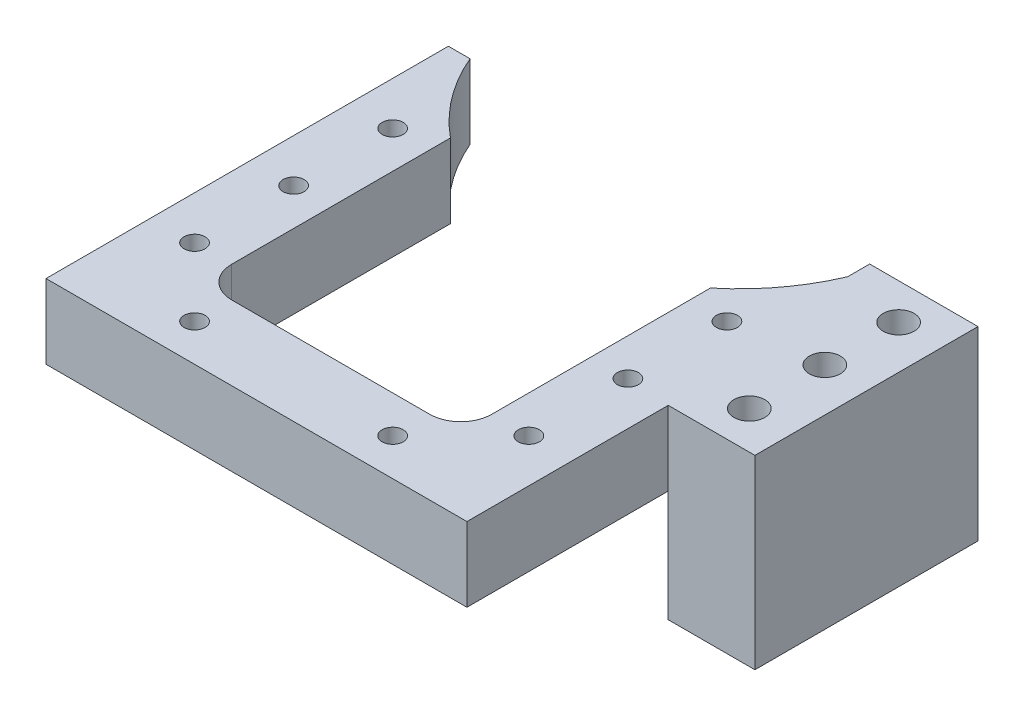
ISO-10303-21;
HEADER;
FILE_DESCRIPTION(('STEP AP214'),'2;1');
FILE_NAME('part.step','',(''),(''),'','','');
FILE_SCHEMA(('AUTOMOTIVE_DESIGN { 1 0 10303 214 1 1 1 1 }'));
ENDSEC;
DATA;
#1=APPLICATION_CONTEXT('core data for automotive mechanical design processes');
#2=APPLICATION_PROTOCOL_DEFINITION('international standard','automotive_design',2000,#1);
#3=PRODUCT_CONTEXT('',#1,'mechanical');
#4=PRODUCT('Part','Part','',(#3));
#5=PRODUCT_RELATED_PRODUCT_CATEGORY('part','',(#4));
#6=PRODUCT_DEFINITION_FORMATION('','',#4);
#7=PRODUCT_DEFINITION_CONTEXT('part definition',#1,'design');
#8=PRODUCT_DEFINITION('design','',#6,#7);
#9=PRODUCT_DEFINITION_SHAPE('','',#8);
#10=(LENGTH_UNIT() NAMED_UNIT(*) SI_UNIT(.MILLI.,.METRE.));
#11=(NAMED_UNIT(*) PLANE_ANGLE_UNIT() SI_UNIT($,.RADIAN.));
#12=(NAMED_UNIT(*) SI_UNIT($,.STERADIAN.) SOLID_ANGLE_UNIT());
#13=UNCERTAINTY_MEASURE_WITH_UNIT(LENGTH_MEASURE(1.E-05),#10,'distance_accuracy_value','');
#14=(GEOMETRIC_REPRESENTATION_CONTEXT(3) GLOBAL_UNCERTAINTY_ASSIGNED_CONTEXT((#13)) GLOBAL_UNIT_ASSIGNED_CONTEXT((#10,
#11,#12)) REPRESENTATION_CONTEXT('',''));
#15=CARTESIAN_POINT('',(0.,0.,0.));
#16=DIRECTION('',(0.,0.,1.));
#17=DIRECTION('',(1.,0.,0.));
#18=AXIS2_PLACEMENT_3D('',#15,#16,#17);
#19=CARTESIAN_POINT('',(17.,-9.,4.72));
#20=DIRECTION('',(1.,0.,0.));
#21=DIRECTION('',(0.,0.,-1.));
#22=AXIS2_PLACEMENT_3D('',#19,#20,#21);
#23=PLANE('',#22);
#24=DIRECTION('',(0.,0.,-1.));
#25=VECTOR('',#24,1.);
#26=CARTESIAN_POINT('',(17.,0.,6.5));
#27=LINE('',#26,#25);
#28=CARTESIAN_POINT('',(17.,0.,22.74));
#29=VERTEX_POINT('',#28);
#30=CARTESIAN_POINT('',(17.,0.,4.72));
#31=VERTEX_POINT('',#30);
#32=EDGE_CURVE('E159',#29,#31,#27,.T.);
#33=ORIENTED_EDGE('',*,*,#32,.T.);
#34=DIRECTION('',(0.,1.,0.));
#35=VECTOR('',#34,1.);
#36=CARTESIAN_POINT('',(17.,-9.,4.72));
#37=LINE('',#36,#35);
#38=CARTESIAN_POINT('',(17.,-9.,4.72));
#39=VERTEX_POINT('',#38);
#40=EDGE_CURVE('E254',#39,#31,#37,.T.);
#41=ORIENTED_EDGE('',*,*,#40,.F.);
#42=DIRECTION('',(0.,0.,-1.));
#43=VECTOR('',#42,1.);
#44=CARTESIAN_POINT('',(17.,-9.,22.74));
#45=LINE('',#44,#43);
#46=CARTESIAN_POINT('',(17.,-9.,22.74));
#47=VERTEX_POINT('',#46);
#48=EDGE_CURVE('E263',#47,#39,#45,.T.);
#49=ORIENTED_EDGE('',*,*,#48,.F.);
#50=DIRECTION('',(0.,1.,0.));
#51=VECTOR('',#50,1.);
#52=CARTESIAN_POINT('',(17.,-9.,22.74));
#53=LINE('',#52,#51);
#54=EDGE_CURVE('E250',#47,#29,#53,.T.);
#55=ORIENTED_EDGE('',*,*,#54,.T.);
#56=EDGE_LOOP('',(#33,#41,#49,#55));
#57=FACE_BOUND('',#56,.T.);
#58=ADVANCED_FACE('F32',(#57),#23,.F.);
#59=CARTESIAN_POINT('',(0.,6.,0.));
#60=DIRECTION('',(0.,1.,0.));
#61=DIRECTION('',(0.,0.,1.));
#62=AXIS2_PLACEMENT_3D('',#59,#60,#61);
#63=PLANE('',#62);
#64=DIRECTION('',(0.,0.,1.));
#65=VECTOR('',#64,1.);
#66=CARTESIAN_POINT('',(15.25,6.,4.72));
#67=LINE('',#66,#65);
#68=CARTESIAN_POINT('',(15.25,6.,4.72));
#69=VERTEX_POINT('',#68);
#70=CARTESIAN_POINT('',(15.25,6.,6.5));
#71=VERTEX_POINT('',#70);
#72=EDGE_CURVE('E122',#69,#71,#67,.T.);
#73=ORIENTED_EDGE('',*,*,#72,.T.);
#74=CARTESIAN_POINT('',(0.,6.,0.));
#75=DIRECTION('',(0.,-1.,0.));
#76=DIRECTION('',(0.,0.,-1.));
#77=AXIS2_PLACEMENT_3D('',#74,#75,#76);
#78=CIRCLE('',#77,16.5774696501004);
#79=CARTESIAN_POINT('',(10.5,6.,12.8281916106675));
#80=VERTEX_POINT('',#79);
#81=EDGE_CURVE('E110',#71,#80,#78,.T.);
#82=ORIENTED_EDGE('',*,*,#81,.T.);
#83=DIRECTION('',(0.,0.,1.));
#84=VECTOR('',#83,1.);
#85=CARTESIAN_POINT('',(10.5,6.,12.8281916106675));
#86=LINE('',#85,#84);
#87=CARTESIAN_POINT('',(10.5,6.,30.5));
#88=VERTEX_POINT('',#87);
#89=EDGE_CURVE('E117',#80,#88,#86,.T.);
#90=ORIENTED_EDGE('',*,*,#89,.T.);
#91=CARTESIAN_POINT('',(8.,6.,30.5));
#92=DIRECTION('',(0.,1.,0.));
#93=DIRECTION('',(0.,0.,1.));
#94=AXIS2_PLACEMENT_3D('',#91,#92,#93);
#95=CIRCLE('',#94,2.49999999999999);
#96=CARTESIAN_POINT('',(8.,6.,33.));
#97=VERTEX_POINT('',#96);
#98=EDGE_CURVE('E296',#97,#88,#95,.T.);
#99=ORIENTED_EDGE('',*,*,#98,.F.);
#100=DIRECTION('',(-1.,0.,0.));
#101=VECTOR('',#100,1.);
#102=CARTESIAN_POINT('',(8.,6.,33.));
#103=LINE('',#102,#101);
#104=CARTESIAN_POINT('',(-8.,6.,33.));
#105=VERTEX_POINT('',#104);
#106=EDGE_CURVE('E140',#97,#105,#103,.T.);
#107=ORIENTED_EDGE('',*,*,#106,.T.);
#108=CARTESIAN_POINT('',(-8.,6.,30.5));
#109=DIRECTION('',(0.,1.,0.));
#110=DIRECTION('',(0.,0.,1.));
#111=AXIS2_PLACEMENT_3D('',#108,#109,#110);
#112=CIRCLE('',#111,2.49999999999999);
#113=CARTESIAN_POINT('',(-10.5,6.,30.5));
#114=VERTEX_POINT('',#113);
#115=EDGE_CURVE('E299',#114,#105,#112,.T.);
#116=ORIENTED_EDGE('',*,*,#115,.F.);
#117=DIRECTION('',(0.,0.,-1.));
#118=VECTOR('',#117,1.);
#119=CARTESIAN_POINT('',(-10.5,6.,12.8281916106675));
#120=LINE('',#119,#118);
#121=CARTESIAN_POINT('',(-10.5,6.,12.8281916106675));
#122=VERTEX_POINT('',#121);
#123=EDGE_CURVE('E143',#114,#122,#120,.T.);
#124=ORIENTED_EDGE('',*,*,#123,.T.);
#125=CARTESIAN_POINT('',(0.,6.,0.));
#126=DIRECTION('',(0.,-1.,0.));
#127=DIRECTION('',(0.,0.,1.));
#128=AXIS2_PLACEMENT_3D('',#125,#126,#127);
#129=CIRCLE('',#128,16.5774696501004);
#130=CARTESIAN_POINT('',(-15.25,6.,6.5));
#131=VERTEX_POINT('',#130);
#132=EDGE_CURVE('E57',#122,#131,#129,.T.);
#133=ORIENTED_EDGE('',*,*,#132,.T.);
#134=DIRECTION('',(-1.,0.,0.));
#135=VECTOR('',#134,1.);
#136=CARTESIAN_POINT('',(-17.,6.,6.5));
#137=LINE('',#136,#135);
#138=CARTESIAN_POINT('',(-17.,6.,6.5));
#139=VERTEX_POINT('',#138);
#140=EDGE_CURVE('E172',#131,#139,#137,.T.);
#141=ORIENTED_EDGE('',*,*,#140,.T.);
#142=DIRECTION('',(0.,0.,1.));
#143=VECTOR('',#142,1.);
#144=CARTESIAN_POINT('',(-17.,6.,6.5));
#145=LINE('',#144,#143);
#146=CARTESIAN_POINT('',(-17.,6.,39.));
#147=VERTEX_POINT('',#146);
#148=EDGE_CURVE('E99',#139,#147,#145,.T.);
#149=ORIENTED_EDGE('',*,*,#148,.T.);
#150=DIRECTION('',(1.,0.,0.));
#151=VECTOR('',#150,1.);
#152=CARTESIAN_POINT('',(-17.,6.,39.));
#153=LINE('',#152,#151);
#154=CARTESIAN_POINT('',(17.,6.,39.));
#155=VERTEX_POINT('',#154);
#156=EDGE_CURVE('E195',#147,#155,#153,.T.);
#157=ORIENTED_EDGE('',*,*,#156,.T.);
#158=DIRECTION('',(0.,0.,-1.));
#159=VECTOR('',#158,1.);
#160=CARTESIAN_POINT('',(17.,6.,33.5));
#161=LINE('',#160,#159);
#162=CARTESIAN_POINT('',(17.,6.,22.74));
#163=VERTEX_POINT('',#162);
#164=EDGE_CURVE('E125',#155,#163,#161,.T.);
#165=ORIENTED_EDGE('',*,*,#164,.T.);
#166=DIRECTION('',(-1.,0.,0.));
#167=VECTOR('',#166,1.);
#168=CARTESIAN_POINT('',(17.,6.,22.74));
#169=LINE('',#168,#167);
#170=CARTESIAN_POINT('',(24.,6.,22.74));
#171=VERTEX_POINT('',#170);
#172=EDGE_CURVE('E49',#171,#163,#169,.T.);
#173=ORIENTED_EDGE('',*,*,#172,.F.);
#174=DIRECTION('',(0.,0.,1.));
#175=VECTOR('',#174,1.);
#176=CARTESIAN_POINT('',(24.,6.,22.74));
#177=LINE('',#176,#175);
#178=CARTESIAN_POINT('',(24.,6.,4.72));
#179=VERTEX_POINT('',#178);
#180=EDGE_CURVE('E275',#179,#171,#177,.T.);
#181=ORIENTED_EDGE('',*,*,#180,.F.);
#182=DIRECTION('',(1.,0.,0.));
#183=VECTOR('',#182,1.);
#184=CARTESIAN_POINT('',(24.,6.,4.72));
#185=LINE('',#184,#183);
#186=EDGE_CURVE('E272',#69,#179,#185,.T.);
#187=ORIENTED_EDGE('',*,*,#186,.F.);
#188=EDGE_LOOP('',(#73,#82,#90,#99,#107,#116,#124,#133,#141,#149,#157,#165,#173,#181,#187));
#189=FACE_BOUND('',#188,.T.);
#190=CARTESIAN_POINT('',(20.5,6.,19.69));
#191=DIRECTION('',(0.,1.,0.));
#192=DIRECTION('',(0.,0.,1.));
#193=AXIS2_PLACEMENT_3D('',#190,#191,#192);
#194=CIRCLE('',#193,1.25);
#195=CARTESIAN_POINT('',(20.5,6.,20.94));
#196=VERTEX_POINT('',#195);
#197=EDGE_CURVE('E290',#196,#196,#194,.T.);
#198=ORIENTED_EDGE('',*,*,#197,.F.);
#199=EDGE_LOOP('',(#198));
#200=FACE_BOUND('',#199,.T.);
#201=CARTESIAN_POINT('',(20.5,6.,13.59));
#202=DIRECTION('',(0.,1.,0.));
#203=DIRECTION('',(0.,0.,1.));
#204=AXIS2_PLACEMENT_3D('',#201,#202,#203);
#205=CIRCLE('',#204,1.25);
#206=CARTESIAN_POINT('',(20.5,6.,14.84));
#207=VERTEX_POINT('',#206);
#208=EDGE_CURVE('E284',#207,#207,#205,.T.);
#209=ORIENTED_EDGE('',*,*,#208,.F.);
#210=EDGE_LOOP('',(#209));
#211=FACE_BOUND('',#210,.T.);
#212=CARTESIAN_POINT('',(20.5,6.,7.63));
#213=DIRECTION('',(0.,1.,0.));
#214=DIRECTION('',(0.,0.,1.));
#215=AXIS2_PLACEMENT_3D('',#212,#213,#214);
#216=CIRCLE('',#215,1.25);
#217=CARTESIAN_POINT('',(20.5,6.,8.88));
#218=VERTEX_POINT('',#217);
#219=EDGE_CURVE('E278',#218,#218,#216,.T.);
#220=ORIENTED_EDGE('',*,*,#219,.F.);
#221=EDGE_LOOP('',(#220));
#222=FACE_BOUND('',#221,.T.);
#223=CARTESIAN_POINT('',(13.5,6.,22.5));
#224=DIRECTION('',(0.,1.,0.));
#225=DIRECTION('',(0.,0.,1.));
#226=AXIS2_PLACEMENT_3D('',#223,#224,#225);
#227=CIRCLE('',#226,0.85);
#228=CARTESIAN_POINT('',(13.5,6.,23.35));
#229=VERTEX_POINT('',#228);
#230=EDGE_CURVE('E235',#229,#229,#227,.T.);
#231=ORIENTED_EDGE('',*,*,#230,.F.);
#232=EDGE_LOOP('',(#231));
#233=FACE_BOUND('',#232,.T.);
#234=CARTESIAN_POINT('',(8.,6.,36.));
#235=DIRECTION('',(0.,1.,0.));
#236=DIRECTION('',(0.,0.,1.));
#237=AXIS2_PLACEMENT_3D('',#234,#235,#236);
#238=CIRCLE('',#237,0.850000000000001);
#239=CARTESIAN_POINT('',(8.,6.,36.85));
#240=VERTEX_POINT('',#239);
#241=EDGE_CURVE('E223',#240,#240,#238,.T.);
#242=ORIENTED_EDGE('',*,*,#241,.F.);
#243=EDGE_LOOP('',(#242));
#244=FACE_BOUND('',#243,.T.);
#245=CARTESIAN_POINT('',(-13.5,6.,14.5));
#246=DIRECTION('',(0.,1.,0.));
#247=DIRECTION('',(0.,0.,1.));
#248=AXIS2_PLACEMENT_3D('',#245,#246,#247);
#249=CIRCLE('',#248,0.85);
#250=CARTESIAN_POINT('',(-13.5,6.,15.35));
#251=VERTEX_POINT('',#250);
#252=EDGE_CURVE('E211',#251,#251,#249,.T.);
#253=ORIENTED_EDGE('',*,*,#252,.F.);
#254=EDGE_LOOP('',(#253));
#255=FACE_BOUND('',#254,.T.);
#256=CARTESIAN_POINT('',(-13.5,6.,30.5));
#257=DIRECTION('',(0.,1.,0.));
#258=DIRECTION('',(0.,0.,1.));
#259=AXIS2_PLACEMENT_3D('',#256,#257,#258);
#260=CIRCLE('',#259,0.85);
#261=CARTESIAN_POINT('',(-13.5,6.,31.35));
#262=VERTEX_POINT('',#261);
#263=EDGE_CURVE('E154',#262,#262,#260,.T.);
#264=ORIENTED_EDGE('',*,*,#263,.F.);
#265=EDGE_LOOP('',(#264));
#266=FACE_BOUND('',#265,.T.);
#267=CARTESIAN_POINT('',(-13.5,6.,22.5));
#268=DIRECTION('',(0.,1.,0.));
#269=DIRECTION('',(0.,0.,1.));
#270=AXIS2_PLACEMENT_3D('',#267,#268,#269);
#271=CIRCLE('',#270,0.85);
#272=CARTESIAN_POINT('',(-13.5,6.,23.35));
#273=VERTEX_POINT('',#272);
#274=EDGE_CURVE('E205',#273,#273,#271,.T.);
#275=ORIENTED_EDGE('',*,*,#274,.F.);
#276=EDGE_LOOP('',(#275));
#277=FACE_BOUND('',#276,.T.);
#278=CARTESIAN_POINT('',(-8.,6.,36.));
#279=DIRECTION('',(0.,1.,0.));
#280=DIRECTION('',(0.,0.,1.));
#281=AXIS2_PLACEMENT_3D('',#278,#279,#280);
#282=CIRCLE('',#281,0.850000000000002);
#283=CARTESIAN_POINT('',(-8.,6.,36.85));
#284=VERTEX_POINT('',#283);
#285=EDGE_CURVE('E217',#284,#284,#282,.T.);
#286=ORIENTED_EDGE('',*,*,#285,.F.);
#287=EDGE_LOOP('',(#286));
#288=FACE_BOUND('',#287,.T.);
#289=CARTESIAN_POINT('',(13.5,6.,30.5));
#290=DIRECTION('',(0.,1.,0.));
#291=DIRECTION('',(0.,0.,1.));
#292=AXIS2_PLACEMENT_3D('',#289,#290,#291);
#293=CIRCLE('',#292,0.85);
#294=CARTESIAN_POINT('',(13.5,6.,31.35));
#295=VERTEX_POINT('',#294);
#296=EDGE_CURVE('E229',#295,#295,#293,.T.);
#297=ORIENTED_EDGE('',*,*,#296,.F.);
#298=EDGE_LOOP('',(#297));
#299=FACE_BOUND('',#298,.T.);
#300=CARTESIAN_POINT('',(13.5,6.,14.5));
#301=DIRECTION('',(0.,1.,0.));
#302=DIRECTION('',(0.,0.,1.));
#303=AXIS2_PLACEMENT_3D('',#300,#301,#302);
#304=CIRCLE('',#303,0.85);
#305=CARTESIAN_POINT('',(13.5,6.,15.35));
#306=VERTEX_POINT('',#305);
#307=EDGE_CURVE('E241',#306,#306,#304,.T.);
#308=ORIENTED_EDGE('',*,*,#307,.F.);
#309=EDGE_LOOP('',(#308));
#310=FACE_BOUND('',#309,.T.);
#311=ADVANCED_FACE('F112',(#189,#200,#211,#222,#233,#244,#255,#266,#277,#288,#299,#310),#63,.T.);
#312=CARTESIAN_POINT('',(0.,0.,0.));
#313=DIRECTION('',(0.,1.,0.));
#314=DIRECTION('',(0.,0.,1.));
#315=AXIS2_PLACEMENT_3D('',#312,#313,#314);
#316=PLANE('',#315);
#317=DIRECTION('',(0.,0.,-1.));
#318=VECTOR('',#317,1.);
#319=CARTESIAN_POINT('',(-10.5,0.,12.8281916106675));
#320=LINE('',#319,#318);
#321=CARTESIAN_POINT('',(-10.5,0.,30.5));
#322=VERTEX_POINT('',#321);
#323=CARTESIAN_POINT('',(-10.5,0.,12.8281916106675));
#324=VERTEX_POINT('',#323);
#325=EDGE_CURVE('E169',#322,#324,#320,.T.);
#326=ORIENTED_EDGE('',*,*,#325,.F.);
#327=CARTESIAN_POINT('',(-8.,0.,30.5));
#328=DIRECTION('',(0.,-1.,0.));
#329=DIRECTION('',(0.,0.,-1.));
#330=AXIS2_PLACEMENT_3D('',#327,#328,#329);
#331=CIRCLE('',#330,2.49999999999999);
#332=CARTESIAN_POINT('',(-8.,0.,33.));
#333=VERTEX_POINT('',#332);
#334=EDGE_CURVE('E304',#333,#322,#331,.T.);
#335=ORIENTED_EDGE('',*,*,#334,.F.);
#336=DIRECTION('',(-1.,0.,0.));
#337=VECTOR('',#336,1.);
#338=CARTESIAN_POINT('',(8.,0.,33.));
#339=LINE('',#338,#337);
#340=CARTESIAN_POINT('',(8.,0.,33.));
#341=VERTEX_POINT('',#340);
#342=EDGE_CURVE('E166',#341,#333,#339,.T.);
#343=ORIENTED_EDGE('',*,*,#342,.F.);
#344=CARTESIAN_POINT('',(8.,0.,30.5));
#345=DIRECTION('',(0.,-1.,0.));
#346=DIRECTION('',(0.,0.,-1.));
#347=AXIS2_PLACEMENT_3D('',#344,#345,#346);
#348=CIRCLE('',#347,2.49999999999999);
#349=CARTESIAN_POINT('',(10.5,0.,30.5));
#350=VERTEX_POINT('',#349);
#351=EDGE_CURVE('E302',#350,#341,#348,.T.);
#352=ORIENTED_EDGE('',*,*,#351,.F.);
#353=DIRECTION('',(0.,0.,1.));
#354=VECTOR('',#353,1.);
#355=CARTESIAN_POINT('',(10.5,0.,12.8281916106675));
#356=LINE('',#355,#354);
#357=CARTESIAN_POINT('',(10.5,0.,12.8281916106675));
#358=VERTEX_POINT('',#357);
#359=EDGE_CURVE('E164',#358,#350,#356,.T.);
#360=ORIENTED_EDGE('',*,*,#359,.F.);
#361=CARTESIAN_POINT('',(0.,0.,0.));
#362=DIRECTION('',(0.,-1.,0.));
#363=DIRECTION('',(0.,0.,-1.));
#364=AXIS2_PLACEMENT_3D('',#361,#362,#363);
#365=CIRCLE('',#364,16.5774696501004);
#366=CARTESIAN_POINT('',(15.25,0.,6.5));
#367=VERTEX_POINT('',#366);
#368=EDGE_CURVE('E131',#367,#358,#365,.T.);
#369=ORIENTED_EDGE('',*,*,#368,.F.);
#370=DIRECTION('',(0.,0.,-1.));
#371=VECTOR('',#370,1.);
#372=CARTESIAN_POINT('',(15.25,0.,4.72));
#373=LINE('',#372,#371);
#374=CARTESIAN_POINT('',(15.25,0.,4.72));
#375=VERTEX_POINT('',#374);
#376=EDGE_CURVE('E309',#367,#375,#373,.T.);
#377=ORIENTED_EDGE('',*,*,#376,.T.);
#378=DIRECTION('',(1.,0.,0.));
#379=VECTOR('',#378,1.);
#380=CARTESIAN_POINT('',(17.,0.,4.72));
#381=LINE('',#380,#379);
#382=EDGE_CURVE('E306',#375,#31,#381,.T.);
#383=ORIENTED_EDGE('',*,*,#382,.T.);
#384=ORIENTED_EDGE('',*,*,#32,.F.);
#385=CARTESIAN_POINT('',(17.,0.,39.));
#386=VERTEX_POINT('',#385);
#387=EDGE_CURVE('E160',#386,#29,#27,.T.);
#388=ORIENTED_EDGE('',*,*,#387,.F.);
#389=DIRECTION('',(1.,0.,0.));
#390=VECTOR('',#389,1.);
#391=CARTESIAN_POINT('',(-17.,0.,39.));
#392=LINE('',#391,#390);
#393=CARTESIAN_POINT('',(-17.,0.,39.));
#394=VERTEX_POINT('',#393);
#395=EDGE_CURVE('E156',#394,#386,#392,.T.);
#396=ORIENTED_EDGE('',*,*,#395,.F.);
#397=DIRECTION('',(0.,0.,1.));
#398=VECTOR('',#397,1.);
#399=CARTESIAN_POINT('',(-17.,0.,33.5));
#400=LINE('',#399,#398);
#401=CARTESIAN_POINT('',(-17.,0.,6.5));
#402=VERTEX_POINT('',#401);
#403=EDGE_CURVE('E153',#402,#394,#400,.T.);
#404=ORIENTED_EDGE('',*,*,#403,.F.);
#405=DIRECTION('',(-1.,0.,0.));
#406=VECTOR('',#405,1.);
#407=CARTESIAN_POINT('',(-17.,0.,6.5));
#408=LINE('',#407,#406);
#409=CARTESIAN_POINT('',(-15.25,0.,6.5));
#410=VERTEX_POINT('',#409);
#411=EDGE_CURVE('E150',#410,#402,#408,.T.);
#412=ORIENTED_EDGE('',*,*,#411,.F.);
#413=CARTESIAN_POINT('',(0.,0.,0.));
#414=DIRECTION('',(0.,-1.,0.));
#415=DIRECTION('',(0.,0.,1.));
#416=AXIS2_PLACEMENT_3D('',#413,#414,#415);
#417=CIRCLE('',#416,16.5774696501004);
#418=EDGE_CURVE('E90',#324,#410,#417,.T.);
#419=ORIENTED_EDGE('',*,*,#418,.F.);
#420=EDGE_LOOP('',(#326,#335,#343,#352,#360,#369,#377,#383,#384,#388,#396,#404,#412,#419));
#421=FACE_BOUND('',#420,.T.);
#422=CARTESIAN_POINT('',(-13.5,0.,30.5));
#423=DIRECTION('',(0.,1.,0.));
#424=DIRECTION('',(0.,0.,1.));
#425=AXIS2_PLACEMENT_3D('',#422,#423,#424);
#426=CIRCLE('',#425,0.85);
#427=CARTESIAN_POINT('',(-13.5,0.,31.35));
#428=VERTEX_POINT('',#427);
#429=EDGE_CURVE('E202',#428,#428,#426,.T.);
#430=ORIENTED_EDGE('',*,*,#429,.T.);
#431=EDGE_LOOP('',(#430));
#432=FACE_BOUND('',#431,.T.);
#433=CARTESIAN_POINT('',(-13.5,0.,22.5));
#434=DIRECTION('',(0.,1.,0.));
#435=DIRECTION('',(0.,0.,1.));
#436=AXIS2_PLACEMENT_3D('',#433,#434,#435);
#437=CIRCLE('',#436,0.85);
#438=CARTESIAN_POINT('',(-13.5,0.,23.35));
#439=VERTEX_POINT('',#438);
#440=EDGE_CURVE('E208',#439,#439,#437,.T.);
#441=ORIENTED_EDGE('',*,*,#440,.T.);
#442=EDGE_LOOP('',(#441));
#443=FACE_BOUND('',#442,.T.);
#444=CARTESIAN_POINT('',(-13.5,0.,14.5));
#445=DIRECTION('',(0.,1.,0.));
#446=DIRECTION('',(0.,0.,1.));
#447=AXIS2_PLACEMENT_3D('',#444,#445,#446);
#448=CIRCLE('',#447,0.85);
#449=CARTESIAN_POINT('',(-13.5,0.,15.35));
#450=VERTEX_POINT('',#449);
#451=EDGE_CURVE('E214',#450,#450,#448,.T.);
#452=ORIENTED_EDGE('',*,*,#451,.T.);
#453=EDGE_LOOP('',(#452));
#454=FACE_BOUND('',#453,.T.);
#455=CARTESIAN_POINT('',(-8.,0.,36.));
#456=DIRECTION('',(0.,1.,0.));
#457=DIRECTION('',(0.,0.,1.));
#458=AXIS2_PLACEMENT_3D('',#455,#456,#457);
#459=CIRCLE('',#458,0.850000000000002);
#460=CARTESIAN_POINT('',(-8.,0.,36.85));
#461=VERTEX_POINT('',#460);
#462=EDGE_CURVE('E220',#461,#461,#459,.T.);
#463=ORIENTED_EDGE('',*,*,#462,.T.);
#464=EDGE_LOOP('',(#463));
#465=FACE_BOUND('',#464,.T.);
#466=CARTESIAN_POINT('',(8.,0.,36.));
#467=DIRECTION('',(0.,1.,0.));
#468=DIRECTION('',(0.,0.,1.));
#469=AXIS2_PLACEMENT_3D('',#466,#467,#468);
#470=CIRCLE('',#469,0.850000000000001);
#471=CARTESIAN_POINT('',(8.,0.,36.85));
#472=VERTEX_POINT('',#471);
#473=EDGE_CURVE('E226',#472,#472,#470,.T.);
#474=ORIENTED_EDGE('',*,*,#473,.T.);
#475=EDGE_LOOP('',(#474));
#476=FACE_BOUND('',#475,.T.);
#477=CARTESIAN_POINT('',(13.5,0.,30.5));
#478=DIRECTION('',(0.,1.,0.));
#479=DIRECTION('',(0.,0.,1.));
#480=AXIS2_PLACEMENT_3D('',#477,#478,#479);
#481=CIRCLE('',#480,0.85);
#482=CARTESIAN_POINT('',(13.5,0.,31.35));
#483=VERTEX_POINT('',#482);
#484=EDGE_CURVE('E232',#483,#483,#481,.T.);
#485=ORIENTED_EDGE('',*,*,#484,.T.);
#486=EDGE_LOOP('',(#485));
#487=FACE_BOUND('',#486,.T.);
#488=CARTESIAN_POINT('',(13.5,0.,22.5));
#489=DIRECTION('',(0.,1.,0.));
#490=DIRECTION('',(0.,0.,1.));
#491=AXIS2_PLACEMENT_3D('',#488,#489,#490);
#492=CIRCLE('',#491,0.85);
#493=CARTESIAN_POINT('',(13.5,0.,23.35));
#494=VERTEX_POINT('',#493);
#495=EDGE_CURVE('E238',#494,#494,#492,.T.);
#496=ORIENTED_EDGE('',*,*,#495,.T.);
#497=EDGE_LOOP('',(#496));
#498=FACE_BOUND('',#497,.T.);
#499=CARTESIAN_POINT('',(13.5,0.,14.5));
#500=DIRECTION('',(0.,1.,0.));
#501=DIRECTION('',(0.,0.,1.));
#502=AXIS2_PLACEMENT_3D('',#499,#500,#501);
#503=CIRCLE('',#502,0.85);
#504=CARTESIAN_POINT('',(13.5,0.,15.35));
#505=VERTEX_POINT('',#504);
#506=EDGE_CURVE('E244',#505,#505,#503,.T.);
#507=ORIENTED_EDGE('',*,*,#506,.T.);
#508=EDGE_LOOP('',(#507));
#509=FACE_BOUND('',#508,.T.);
#510=ADVANCED_FACE('F320',(#421,#432,#443,#454,#465,#476,#487,#498,#509),#316,.F.);
#511=CARTESIAN_POINT('',(-17.,6.,6.5));
#512=DIRECTION('',(0.,0.,1.));
#513=DIRECTION('',(1.,0.,0.));
#514=AXIS2_PLACEMENT_3D('',#511,#512,#513);
#515=PLANE('',#514);
#516=ORIENTED_EDGE('',*,*,#411,.T.);
#517=DIRECTION('',(0.,-1.,0.));
#518=VECTOR('',#517,1.);
#519=CARTESIAN_POINT('',(-17.,6.,6.5));
#520=LINE('',#519,#518);
#521=EDGE_CURVE('E41',#139,#402,#520,.T.);
#522=ORIENTED_EDGE('',*,*,#521,.F.);
#523=ORIENTED_EDGE('',*,*,#140,.F.);
#524=DIRECTION('',(0.,-1.,0.));
#525=VECTOR('',#524,1.);
#526=CARTESIAN_POINT('',(-15.25,6.,6.5));
#527=LINE('',#526,#525);
#528=EDGE_CURVE('E149',#131,#410,#527,.T.);
#529=ORIENTED_EDGE('',*,*,#528,.T.);
#530=EDGE_LOOP('',(#516,#522,#523,#529));
#531=FACE_BOUND('',#530,.T.);
#532=ADVANCED_FACE('F34',(#531),#515,.F.);
#533=CARTESIAN_POINT('',(-17.,6.,33.5));
#534=DIRECTION('',(1.,0.,0.));
#535=DIRECTION('',(0.,0.,-1.));
#536=AXIS2_PLACEMENT_3D('',#533,#534,#535);
#537=PLANE('',#536);
#538=ORIENTED_EDGE('',*,*,#403,.T.);
#539=DIRECTION('',(0.,-1.,0.));
#540=VECTOR('',#539,1.);
#541=CARTESIAN_POINT('',(-17.,6.,39.));
#542=LINE('',#541,#540);
#543=EDGE_CURVE('E190',#147,#394,#542,.T.);
#544=ORIENTED_EDGE('',*,*,#543,.F.);
#545=ORIENTED_EDGE('',*,*,#148,.F.);
#546=ORIENTED_EDGE('',*,*,#521,.T.);
#547=EDGE_LOOP('',(#538,#544,#545,#546));
#548=FACE_BOUND('',#547,.T.);
#549=ADVANCED_FACE('F387',(#548),#537,.F.);
#550=CARTESIAN_POINT('',(-17.,6.,39.));
#551=DIRECTION('',(0.,0.,-1.));
#552=DIRECTION('',(-1.,0.,0.));
#553=AXIS2_PLACEMENT_3D('',#550,#551,#552);
#554=PLANE('',#553);
#555=ORIENTED_EDGE('',*,*,#395,.T.);
#556=DIRECTION('',(0.,-1.,0.));
#557=VECTOR('',#556,1.);
#558=CARTESIAN_POINT('',(17.,6.,39.));
#559=LINE('',#558,#557);
#560=EDGE_CURVE('E187',#155,#386,#559,.T.);
#561=ORIENTED_EDGE('',*,*,#560,.F.);
#562=ORIENTED_EDGE('',*,*,#156,.F.);
#563=ORIENTED_EDGE('',*,*,#543,.T.);
#564=EDGE_LOOP('',(#555,#561,#562,#563));
#565=FACE_BOUND('',#564,.T.);
#566=ADVANCED_FACE('F384',(#565),#554,.F.);
#567=CARTESIAN_POINT('',(17.,6.,6.5));
#568=DIRECTION('',(-1.,0.,0.));
#569=DIRECTION('',(0.,0.,1.));
#570=AXIS2_PLACEMENT_3D('',#567,#568,#569);
#571=PLANE('',#570);
#572=ORIENTED_EDGE('',*,*,#387,.T.);
#573=EDGE_CURVE('E11',#29,#163,#53,.T.);
#574=ORIENTED_EDGE('',*,*,#573,.T.);
#575=ORIENTED_EDGE('',*,*,#164,.F.);
#576=ORIENTED_EDGE('',*,*,#560,.T.);
#577=EDGE_LOOP('',(#572,#574,#575,#576));
#578=FACE_BOUND('',#577,.T.);
#579=ADVANCED_FACE('F379',(#578),#571,.F.);
#580=CARTESIAN_POINT('',(0.,6.,0.));
#581=DIRECTION('',(0.,-1.,0.));
#582=DIRECTION('',(0.,0.,-1.));
#583=AXIS2_PLACEMENT_3D('',#580,#581,#582);
#584=CYLINDRICAL_SURFACE('',#583,16.5774696501004);
#585=ORIENTED_EDGE('',*,*,#368,.T.);
#586=DIRECTION('',(0.,-1.,0.));
#587=VECTOR('',#586,1.);
#588=CARTESIAN_POINT('',(10.5,6.,12.8281916106675));
#589=LINE('',#588,#587);
#590=EDGE_CURVE('E128',#80,#358,#589,.T.);
#591=ORIENTED_EDGE('',*,*,#590,.F.);
#592=ORIENTED_EDGE('',*,*,#81,.F.);
#593=DIRECTION('',(0.,-1.,0.));
#594=VECTOR('',#593,1.);
#595=CARTESIAN_POINT('',(15.25,6.,6.5));
#596=LINE('',#595,#594);
#597=EDGE_CURVE('E135',#71,#367,#596,.T.);
#598=ORIENTED_EDGE('',*,*,#597,.T.);
#599=EDGE_LOOP('',(#585,#591,#592,#598));
#600=FACE_BOUND('',#599,.T.);
#601=ADVANCED_FACE('F129',(#600),#584,.F.);
#602=CARTESIAN_POINT('',(10.5,6.,12.8281916106675));
#603=DIRECTION('',(1.,0.,0.));
#604=DIRECTION('',(0.,0.,-1.));
#605=AXIS2_PLACEMENT_3D('',#602,#603,#604);
#606=PLANE('',#605);
#607=ORIENTED_EDGE('',*,*,#359,.T.);
#608=DIRECTION('',(0.,-1.,0.));
#609=VECTOR('',#608,1.);
#610=CARTESIAN_POINT('',(10.5,6.,30.5));
#611=LINE('',#610,#609);
#612=EDGE_CURVE('E136',#88,#350,#611,.T.);
#613=ORIENTED_EDGE('',*,*,#612,.F.);
#614=ORIENTED_EDGE('',*,*,#89,.F.);
#615=ORIENTED_EDGE('',*,*,#590,.T.);
#616=EDGE_LOOP('',(#607,#613,#614,#615));
#617=FACE_BOUND('',#616,.T.);
#618=ADVANCED_FACE('F138',(#617),#606,.F.);
#619=CARTESIAN_POINT('',(8.,6.,33.));
#620=DIRECTION('',(0.,0.,1.));
#621=DIRECTION('',(1.,0.,0.));
#622=AXIS2_PLACEMENT_3D('',#619,#620,#621);
#623=PLANE('',#622);
#624=ORIENTED_EDGE('',*,*,#342,.T.);
#625=DIRECTION('',(0.,-1.,0.));
#626=VECTOR('',#625,1.);
#627=CARTESIAN_POINT('',(-8.,6.,33.));
#628=LINE('',#627,#626);
#629=EDGE_CURVE('E179',#105,#333,#628,.T.);
#630=ORIENTED_EDGE('',*,*,#629,.F.);
#631=ORIENTED_EDGE('',*,*,#106,.F.);
#632=DIRECTION('',(0.,-1.,0.));
#633=VECTOR('',#632,1.);
#634=CARTESIAN_POINT('',(8.,6.,33.));
#635=LINE('',#634,#633);
#636=EDGE_CURVE('E182',#97,#341,#635,.T.);
#637=ORIENTED_EDGE('',*,*,#636,.T.);
#638=EDGE_LOOP('',(#624,#630,#631,#637));
#639=FACE_BOUND('',#638,.T.);
#640=ADVANCED_FACE('F403',(#639),#623,.F.);
#641=CARTESIAN_POINT('',(-10.5,6.,12.8281916106675));
#642=DIRECTION('',(-1.,0.,0.));
#643=DIRECTION('',(0.,0.,1.));
#644=AXIS2_PLACEMENT_3D('',#641,#642,#643);
#645=PLANE('',#644);
#646=ORIENTED_EDGE('',*,*,#325,.T.);
#647=DIRECTION('',(0.,-1.,0.));
#648=VECTOR('',#647,1.);
#649=CARTESIAN_POINT('',(-10.5,6.,12.8281916106675));
#650=LINE('',#649,#648);
#651=EDGE_CURVE('E174',#122,#324,#650,.T.);
#652=ORIENTED_EDGE('',*,*,#651,.F.);
#653=ORIENTED_EDGE('',*,*,#123,.F.);
#654=DIRECTION('',(0.,-1.,0.));
#655=VECTOR('',#654,1.);
#656=CARTESIAN_POINT('',(-10.5,6.,30.5));
#657=LINE('',#656,#655);
#658=EDGE_CURVE('E176',#114,#322,#657,.T.);
#659=ORIENTED_EDGE('',*,*,#658,.T.);
#660=EDGE_LOOP('',(#646,#652,#653,#659));
#661=FACE_BOUND('',#660,.T.);
#662=ADVANCED_FACE('F396',(#661),#645,.F.);
#663=CARTESIAN_POINT('',(0.,6.,0.));
#664=DIRECTION('',(0.,-1.,0.));
#665=DIRECTION('',(0.,0.,-1.));
#666=AXIS2_PLACEMENT_3D('',#663,#664,#665);
#667=CYLINDRICAL_SURFACE('',#666,16.5774696501004);
#668=ORIENTED_EDGE('',*,*,#418,.T.);
#669=ORIENTED_EDGE('',*,*,#528,.F.);
#670=ORIENTED_EDGE('',*,*,#132,.F.);
#671=ORIENTED_EDGE('',*,*,#651,.T.);
#672=EDGE_LOOP('',(#668,#669,#670,#671));
#673=FACE_BOUND('',#672,.T.);
#674=ADVANCED_FACE('F390',(#673),#667,.F.);
#675=CARTESIAN_POINT('',(-13.5,6.,30.5));
#676=DIRECTION('',(0.,-1.,0.));
#677=DIRECTION('',(0.,0.,-1.));
#678=AXIS2_PLACEMENT_3D('',#675,#676,#677);
#679=CYLINDRICAL_SURFACE('',#678,0.85);
#680=ORIENTED_EDGE('',*,*,#263,.T.);
#681=EDGE_LOOP('',(#680));
#682=FACE_BOUND('',#681,.T.);
#683=ORIENTED_EDGE('',*,*,#429,.F.);
#684=EDGE_LOOP('',(#683));
#685=FACE_BOUND('',#684,.T.);
#686=ADVANCED_FACE('F456',(#682,#685),#679,.F.);
#687=CARTESIAN_POINT('',(-13.5,6.,22.5));
#688=DIRECTION('',(0.,-1.,0.));
#689=DIRECTION('',(0.,0.,-1.));
#690=AXIS2_PLACEMENT_3D('',#687,#688,#689);
#691=CYLINDRICAL_SURFACE('',#690,0.85);
#692=ORIENTED_EDGE('',*,*,#274,.T.);
#693=EDGE_LOOP('',(#692));
#694=FACE_BOUND('',#693,.T.);
#695=ORIENTED_EDGE('',*,*,#440,.F.);
#696=EDGE_LOOP('',(#695));
#697=FACE_BOUND('',#696,.T.);
#698=ADVANCED_FACE('F452',(#694,#697),#691,.F.);
#699=CARTESIAN_POINT('',(-13.5,6.,14.5));
#700=DIRECTION('',(0.,-1.,0.));
#701=DIRECTION('',(0.,0.,-1.));
#702=AXIS2_PLACEMENT_3D('',#699,#700,#701);
#703=CYLINDRICAL_SURFACE('',#702,0.85);
#704=ORIENTED_EDGE('',*,*,#252,.T.);
#705=EDGE_LOOP('',(#704));
#706=FACE_BOUND('',#705,.T.);
#707=ORIENTED_EDGE('',*,*,#451,.F.);
#708=EDGE_LOOP('',(#707));
#709=FACE_BOUND('',#708,.T.);
#710=ADVANCED_FACE('F448',(#706,#709),#703,.F.);
#711=CARTESIAN_POINT('',(-8.,6.,36.));
#712=DIRECTION('',(0.,-1.,0.));
#713=DIRECTION('',(0.,0.,-1.));
#714=AXIS2_PLACEMENT_3D('',#711,#712,#713);
#715=CYLINDRICAL_SURFACE('',#714,0.850000000000002);
#716=ORIENTED_EDGE('',*,*,#285,.T.);
#717=EDGE_LOOP('',(#716));
#718=FACE_BOUND('',#717,.T.);
#719=ORIENTED_EDGE('',*,*,#462,.F.);
#720=EDGE_LOOP('',(#719));
#721=FACE_BOUND('',#720,.T.);
#722=ADVANCED_FACE('F444',(#718,#721),#715,.F.);
#723=CARTESIAN_POINT('',(8.,6.,36.));
#724=DIRECTION('',(0.,-1.,0.));
#725=DIRECTION('',(0.,0.,-1.));
#726=AXIS2_PLACEMENT_3D('',#723,#724,#725);
#727=CYLINDRICAL_SURFACE('',#726,0.850000000000001);
#728=ORIENTED_EDGE('',*,*,#241,.T.);
#729=EDGE_LOOP('',(#728));
#730=FACE_BOUND('',#729,.T.);
#731=ORIENTED_EDGE('',*,*,#473,.F.);
#732=EDGE_LOOP('',(#731));
#733=FACE_BOUND('',#732,.T.);
#734=ADVANCED_FACE('F440',(#730,#733),#727,.F.);
#735=CARTESIAN_POINT('',(13.5,6.,30.5));
#736=DIRECTION('',(0.,-1.,0.));
#737=DIRECTION('',(0.,0.,-1.));
#738=AXIS2_PLACEMENT_3D('',#735,#736,#737);
#739=CYLINDRICAL_SURFACE('',#738,0.85);
#740=ORIENTED_EDGE('',*,*,#296,.T.);
#741=EDGE_LOOP('',(#740));
#742=FACE_BOUND('',#741,.T.);
#743=ORIENTED_EDGE('',*,*,#484,.F.);
#744=EDGE_LOOP('',(#743));
#745=FACE_BOUND('',#744,.T.);
#746=ADVANCED_FACE('F436',(#742,#745),#739,.F.);
#747=CARTESIAN_POINT('',(13.5,6.,22.5));
#748=DIRECTION('',(0.,-1.,0.));
#749=DIRECTION('',(0.,0.,-1.));
#750=AXIS2_PLACEMENT_3D('',#747,#748,#749);
#751=CYLINDRICAL_SURFACE('',#750,0.85);
#752=ORIENTED_EDGE('',*,*,#230,.T.);
#753=EDGE_LOOP('',(#752));
#754=FACE_BOUND('',#753,.T.);
#755=ORIENTED_EDGE('',*,*,#495,.F.);
#756=EDGE_LOOP('',(#755));
#757=FACE_BOUND('',#756,.T.);
#758=ADVANCED_FACE('F432',(#754,#757),#751,.F.);
#759=CARTESIAN_POINT('',(13.5,6.,14.5));
#760=DIRECTION('',(0.,-1.,0.));
#761=DIRECTION('',(0.,0.,-1.));
#762=AXIS2_PLACEMENT_3D('',#759,#760,#761);
#763=CYLINDRICAL_SURFACE('',#762,0.85);
#764=ORIENTED_EDGE('',*,*,#307,.T.);
#765=EDGE_LOOP('',(#764));
#766=FACE_BOUND('',#765,.T.);
#767=ORIENTED_EDGE('',*,*,#506,.F.);
#768=EDGE_LOOP('',(#767));
#769=FACE_BOUND('',#768,.T.);
#770=ADVANCED_FACE('F429',(#766,#769),#763,.F.);
#771=CARTESIAN_POINT('',(24.,-9.,22.74));
#772=DIRECTION('',(-1.,0.,0.));
#773=DIRECTION('',(0.,0.,1.));
#774=AXIS2_PLACEMENT_3D('',#771,#772,#773);
#775=PLANE('',#774);
#776=DIRECTION('',(0.,1.,0.));
#777=VECTOR('',#776,1.);
#778=CARTESIAN_POINT('',(24.,-9.,4.72));
#779=LINE('',#778,#777);
#780=CARTESIAN_POINT('',(24.,-9.,4.72));
#781=VERTEX_POINT('',#780);
#782=EDGE_CURVE('E257',#781,#179,#779,.T.);
#783=ORIENTED_EDGE('',*,*,#782,.T.);
#784=ORIENTED_EDGE('',*,*,#180,.T.);
#785=DIRECTION('',(0.,1.,0.));
#786=VECTOR('',#785,1.);
#787=CARTESIAN_POINT('',(24.,-9.,22.74));
#788=LINE('',#787,#786);
#789=CARTESIAN_POINT('',(24.,-9.,22.74));
#790=VERTEX_POINT('',#789);
#791=EDGE_CURVE('E247',#790,#171,#788,.T.);
#792=ORIENTED_EDGE('',*,*,#791,.F.);
#793=DIRECTION('',(0.,0.,1.));
#794=VECTOR('',#793,1.);
#795=CARTESIAN_POINT('',(24.,-9.,22.74));
#796=LINE('',#795,#794);
#797=EDGE_CURVE('E269',#781,#790,#796,.T.);
#798=ORIENTED_EDGE('',*,*,#797,.F.);
#799=EDGE_LOOP('',(#783,#784,#792,#798));
#800=FACE_BOUND('',#799,.T.);
#801=ADVANCED_FACE('F373',(#800),#775,.F.);
#802=CARTESIAN_POINT('',(17.,-9.,22.74));
#803=DIRECTION('',(0.,0.,-1.));
#804=DIRECTION('',(-1.,0.,0.));
#805=AXIS2_PLACEMENT_3D('',#802,#803,#804);
#806=PLANE('',#805);
#807=ORIENTED_EDGE('',*,*,#791,.T.);
#808=ORIENTED_EDGE('',*,*,#172,.T.);
#809=ORIENTED_EDGE('',*,*,#573,.F.);
#810=ORIENTED_EDGE('',*,*,#54,.F.);
#811=DIRECTION('',(-1.,0.,0.));
#812=VECTOR('',#811,1.);
#813=CARTESIAN_POINT('',(17.,-9.,22.74));
#814=LINE('',#813,#812);
#815=EDGE_CURVE('E266',#790,#47,#814,.T.);
#816=ORIENTED_EDGE('',*,*,#815,.F.);
#817=EDGE_LOOP('',(#807,#808,#809,#810,#816));
#818=FACE_BOUND('',#817,.T.);
#819=ADVANCED_FACE('F376',(#818),#806,.F.);
#820=CARTESIAN_POINT('',(24.,-9.,4.72));
#821=DIRECTION('',(0.,0.,1.));
#822=DIRECTION('',(1.,0.,0.));
#823=AXIS2_PLACEMENT_3D('',#820,#821,#822);
#824=PLANE('',#823);
#825=ORIENTED_EDGE('',*,*,#40,.T.);
#826=ORIENTED_EDGE('',*,*,#382,.F.);
#827=DIRECTION('',(0.,1.,0.));
#828=VECTOR('',#827,1.);
#829=CARTESIAN_POINT('',(15.25,-2.49617707705203,4.72));
#830=LINE('',#829,#828);
#831=EDGE_CURVE('E310',#375,#69,#830,.T.);
#832=ORIENTED_EDGE('',*,*,#831,.T.);
#833=ORIENTED_EDGE('',*,*,#186,.T.);
#834=ORIENTED_EDGE('',*,*,#782,.F.);
#835=DIRECTION('',(1.,0.,0.));
#836=VECTOR('',#835,1.);
#837=CARTESIAN_POINT('',(24.,-9.,4.72));
#838=LINE('',#837,#836);
#839=EDGE_CURVE('E260',#39,#781,#838,.T.);
#840=ORIENTED_EDGE('',*,*,#839,.F.);
#841=EDGE_LOOP('',(#825,#826,#832,#833,#834,#840));
#842=FACE_BOUND('',#841,.T.);
#843=ADVANCED_FACE('F332',(#842),#824,.F.);
#844=CARTESIAN_POINT('',(0.,-9.,0.));
#845=DIRECTION('',(0.,1.,0.));
#846=DIRECTION('',(0.,0.,1.));
#847=AXIS2_PLACEMENT_3D('',#844,#845,#846);
#848=PLANE('',#847);
#849=CARTESIAN_POINT('',(20.5,-9.,19.69));
#850=DIRECTION('',(0.,-1.,0.));
#851=DIRECTION('',(0.,0.,-1.));
#852=AXIS2_PLACEMENT_3D('',#849,#850,#851);
#853=CIRCLE('',#852,1.25);
#854=CARTESIAN_POINT('',(20.5,-9.,18.44));
#855=VERTEX_POINT('',#854);
#856=EDGE_CURVE('E293',#855,#855,#853,.T.);
#857=ORIENTED_EDGE('',*,*,#856,.F.);
#858=EDGE_LOOP('',(#857));
#859=FACE_BOUND('',#858,.T.);
#860=CARTESIAN_POINT('',(20.5,-9.,13.59));
#861=DIRECTION('',(0.,-1.,0.));
#862=DIRECTION('',(0.,0.,-1.));
#863=AXIS2_PLACEMENT_3D('',#860,#861,#862);
#864=CIRCLE('',#863,1.25);
#865=CARTESIAN_POINT('',(20.5,-9.,12.34));
#866=VERTEX_POINT('',#865);
#867=EDGE_CURVE('E287',#866,#866,#864,.T.);
#868=ORIENTED_EDGE('',*,*,#867,.F.);
#869=EDGE_LOOP('',(#868));
#870=FACE_BOUND('',#869,.T.);
#871=CARTESIAN_POINT('',(20.5,-9.,7.63));
#872=DIRECTION('',(0.,-1.,0.));
#873=DIRECTION('',(0.,0.,-1.));
#874=AXIS2_PLACEMENT_3D('',#871,#872,#873);
#875=CIRCLE('',#874,1.25);
#876=CARTESIAN_POINT('',(20.5,-9.,6.38));
#877=VERTEX_POINT('',#876);
#878=EDGE_CURVE('E281',#877,#877,#875,.T.);
#879=ORIENTED_EDGE('',*,*,#878,.F.);
#880=EDGE_LOOP('',(#879));
#881=FACE_BOUND('',#880,.T.);
#882=ORIENTED_EDGE('',*,*,#797,.T.);
#883=ORIENTED_EDGE('',*,*,#815,.T.);
#884=ORIENTED_EDGE('',*,*,#48,.T.);
#885=ORIENTED_EDGE('',*,*,#839,.T.);
#886=EDGE_LOOP('',(#882,#883,#884,#885));
#887=FACE_BOUND('',#886,.T.);
#888=ADVANCED_FACE('F374',(#859,#870,#881,#887),#848,.F.);
#889=CARTESIAN_POINT('',(20.5,6.00005,7.63));
#890=DIRECTION('',(0.,-1.,0.));
#891=DIRECTION('',(0.,0.,-1.));
#892=AXIS2_PLACEMENT_3D('',#889,#890,#891);
#893=CYLINDRICAL_SURFACE('',#892,1.25);
#894=ORIENTED_EDGE('',*,*,#219,.T.);
#895=EDGE_LOOP('',(#894));
#896=FACE_BOUND('',#895,.T.);
#897=ORIENTED_EDGE('',*,*,#878,.T.);
#898=EDGE_LOOP('',(#897));
#899=FACE_BOUND('',#898,.T.);
#900=ADVANCED_FACE('F546',(#896,#899),#893,.F.);
#901=CARTESIAN_POINT('',(20.5,6.00005,13.59));
#902=DIRECTION('',(0.,-1.,0.));
#903=DIRECTION('',(0.,0.,-1.));
#904=AXIS2_PLACEMENT_3D('',#901,#902,#903);
#905=CYLINDRICAL_SURFACE('',#904,1.25);
#906=ORIENTED_EDGE('',*,*,#208,.T.);
#907=EDGE_LOOP('',(#906));
#908=FACE_BOUND('',#907,.T.);
#909=ORIENTED_EDGE('',*,*,#867,.T.);
#910=EDGE_LOOP('',(#909));
#911=FACE_BOUND('',#910,.T.);
#912=ADVANCED_FACE('F536',(#908,#911),#905,.F.);
#913=CARTESIAN_POINT('',(20.5,6.00005,19.69));
#914=DIRECTION('',(0.,-1.,0.));
#915=DIRECTION('',(0.,0.,-1.));
#916=AXIS2_PLACEMENT_3D('',#913,#914,#915);
#917=CYLINDRICAL_SURFACE('',#916,1.25);
#918=ORIENTED_EDGE('',*,*,#197,.T.);
#919=EDGE_LOOP('',(#918));
#920=FACE_BOUND('',#919,.T.);
#921=ORIENTED_EDGE('',*,*,#856,.T.);
#922=EDGE_LOOP('',(#921));
#923=FACE_BOUND('',#922,.T.);
#924=ADVANCED_FACE('F414',(#920,#923),#917,.F.);
#925=CARTESIAN_POINT('',(-8.,10.,30.5));
#926=DIRECTION('',(0.,-1.,0.));
#927=DIRECTION('',(0.,0.,-1.));
#928=AXIS2_PLACEMENT_3D('',#925,#926,#927);
#929=CYLINDRICAL_SURFACE('',#928,2.49999999999999);
#930=ORIENTED_EDGE('',*,*,#115,.T.);
#931=ORIENTED_EDGE('',*,*,#629,.T.);
#932=ORIENTED_EDGE('',*,*,#334,.T.);
#933=ORIENTED_EDGE('',*,*,#658,.F.);
#934=EDGE_LOOP('',(#930,#931,#932,#933));
#935=FACE_BOUND('',#934,.T.);
#936=ADVANCED_FACE('F399',(#935),#929,.F.);
#937=CARTESIAN_POINT('',(8.,10.,30.5));
#938=DIRECTION('',(0.,-1.,0.));
#939=DIRECTION('',(0.,0.,-1.));
#940=AXIS2_PLACEMENT_3D('',#937,#938,#939);
#941=CYLINDRICAL_SURFACE('',#940,2.49999999999999);
#942=ORIENTED_EDGE('',*,*,#98,.T.);
#943=ORIENTED_EDGE('',*,*,#612,.T.);
#944=ORIENTED_EDGE('',*,*,#351,.T.);
#945=ORIENTED_EDGE('',*,*,#636,.F.);
#946=EDGE_LOOP('',(#942,#943,#944,#945));
#947=FACE_BOUND('',#946,.T.);
#948=ADVANCED_FACE('F406',(#947),#941,.F.);
#949=CARTESIAN_POINT('',(15.25,-2.49617707705203,4.72));
#950=DIRECTION('',(-1.,0.,0.));
#951=DIRECTION('',(0.,0.,1.));
#952=AXIS2_PLACEMENT_3D('',#949,#950,#951);
#953=PLANE('',#952);
#954=ORIENTED_EDGE('',*,*,#376,.F.);
#955=ORIENTED_EDGE('',*,*,#597,.F.);
#956=ORIENTED_EDGE('',*,*,#72,.F.);
#957=ORIENTED_EDGE('',*,*,#831,.F.);
#958=EDGE_LOOP('',(#954,#955,#956,#957));
#959=FACE_BOUND('',#958,.T.);
#960=ADVANCED_FACE('F329',(#959),#953,.T.);
#961=CLOSED_SHELL('',(#58,#311,#510,#532,#549,#566,#579,#601,#618,#640,#662,#674,#686,#698,#710,
#722,#734,#746,#758,#770,#801,#819,#843,#888,#900,#912,#924,#936,#948,#960));
#962=MANIFOLD_SOLID_BREP('B2',#961);
#963=ADVANCED_BREP_SHAPE_REPRESENTATION('',(#18,#962),#14);
#964=SHAPE_DEFINITION_REPRESENTATION(#9,#963);
ENDSEC;
END-ISO-10303-21;
